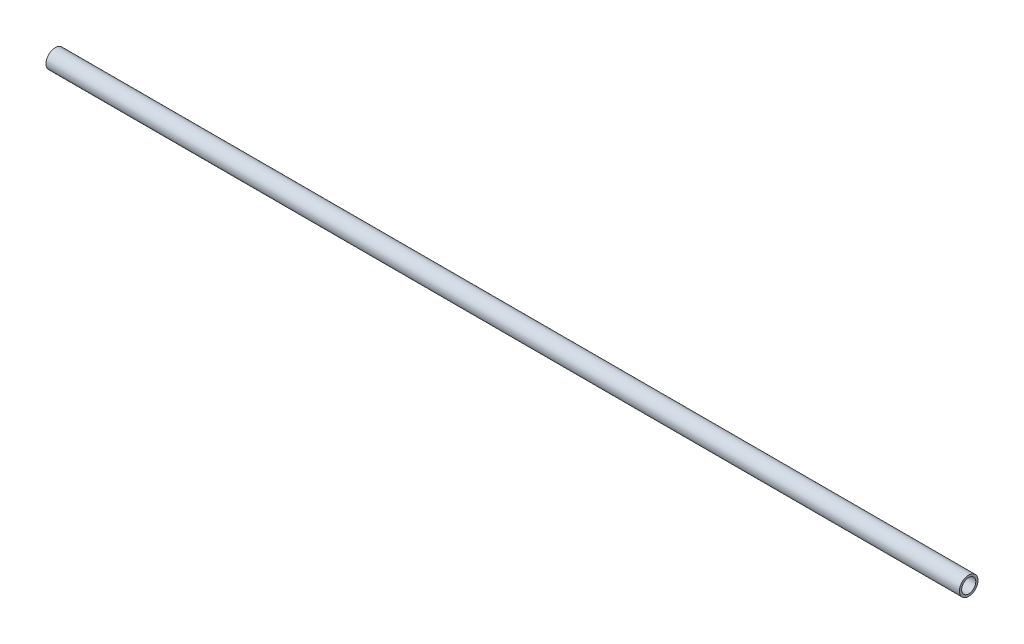
ISO-10303-21;
HEADER;
FILE_DESCRIPTION(('STEP AP214'),'2;1');
FILE_NAME('part.step','',(''),(''),'','','');
FILE_SCHEMA(('AUTOMOTIVE_DESIGN { 1 0 10303 214 1 1 1 1 }'));
ENDSEC;
DATA;
#1=APPLICATION_CONTEXT('core data for automotive mechanical design processes');
#2=APPLICATION_PROTOCOL_DEFINITION('international standard','automotive_design',2000,#1);
#3=PRODUCT_CONTEXT('',#1,'mechanical');
#4=PRODUCT('Part','Part','',(#3));
#5=PRODUCT_RELATED_PRODUCT_CATEGORY('part','',(#4));
#6=PRODUCT_DEFINITION_FORMATION('','',#4);
#7=PRODUCT_DEFINITION_CONTEXT('part definition',#1,'design');
#8=PRODUCT_DEFINITION('design','',#6,#7);
#9=PRODUCT_DEFINITION_SHAPE('','',#8);
#10=(LENGTH_UNIT() NAMED_UNIT(*) SI_UNIT(.MILLI.,.METRE.));
#11=(NAMED_UNIT(*) PLANE_ANGLE_UNIT() SI_UNIT($,.RADIAN.));
#12=(NAMED_UNIT(*) SI_UNIT($,.STERADIAN.) SOLID_ANGLE_UNIT());
#13=UNCERTAINTY_MEASURE_WITH_UNIT(LENGTH_MEASURE(1.E-05),#10,'distance_accuracy_value','');
#14=(GEOMETRIC_REPRESENTATION_CONTEXT(3) GLOBAL_UNCERTAINTY_ASSIGNED_CONTEXT((#13)) GLOBAL_UNIT_ASSIGNED_CONTEXT((#10,
#11,#12)) REPRESENTATION_CONTEXT('',''));
#15=CARTESIAN_POINT('',(0.,0.,0.));
#16=DIRECTION('',(0.,0.,1.));
#17=DIRECTION('',(1.,0.,0.));
#18=AXIS2_PLACEMENT_3D('',#15,#16,#17);
#19=CARTESIAN_POINT('',(1250.,0.,0.));
#20=DIRECTION('',(1.,0.,0.));
#21=DIRECTION('',(0.,0.,-1.));
#22=AXIS2_PLACEMENT_3D('',#19,#20,#21);
#23=PLANE('',#22);
#24=CARTESIAN_POINT('',(1250.,0.,0.));
#25=DIRECTION('',(1.,0.,0.));
#26=DIRECTION('',(0.,0.,-1.));
#27=AXIS2_PLACEMENT_3D('',#24,#25,#26);
#28=CIRCLE('',#27,12.7);
#29=CARTESIAN_POINT('',(1250.,0.,-12.7));
#30=VERTEX_POINT('',#29);
#31=EDGE_CURVE('E10',#30,#30,#28,.T.);
#32=ORIENTED_EDGE('',*,*,#31,.T.);
#33=EDGE_LOOP('',(#32));
#34=FACE_BOUND('',#33,.T.);
#35=CARTESIAN_POINT('',(1250.,0.,0.));
#36=DIRECTION('',(1.,0.,0.));
#37=DIRECTION('',(0.,0.,-1.));
#38=AXIS2_PLACEMENT_3D('',#35,#36,#37);
#39=CIRCLE('',#38,9.652);
#40=CARTESIAN_POINT('',(1250.,0.,-9.652));
#41=VERTEX_POINT('',#40);
#42=EDGE_CURVE('E45',#41,#41,#39,.T.);
#43=ORIENTED_EDGE('',*,*,#42,.F.);
#44=EDGE_LOOP('',(#43));
#45=FACE_BOUND('',#44,.T.);
#46=ADVANCED_FACE('F34',(#34,#45),#23,.T.);
#47=CARTESIAN_POINT('',(0.,0.,0.));
#48=DIRECTION('',(1.,0.,0.));
#49=DIRECTION('',(0.,0.,-1.));
#50=AXIS2_PLACEMENT_3D('',#47,#48,#49);
#51=PLANE('',#50);
#52=CARTESIAN_POINT('',(0.,0.,0.));
#53=DIRECTION('',(1.,0.,0.));
#54=DIRECTION('',(0.,0.,-1.));
#55=AXIS2_PLACEMENT_3D('',#52,#53,#54);
#56=CIRCLE('',#55,12.7);
#57=CARTESIAN_POINT('',(0.,0.,-12.7));
#58=VERTEX_POINT('',#57);
#59=EDGE_CURVE('E38',#58,#58,#56,.T.);
#60=ORIENTED_EDGE('',*,*,#59,.F.);
#61=EDGE_LOOP('',(#60));
#62=FACE_BOUND('',#61,.T.);
#63=CARTESIAN_POINT('',(0.,0.,0.));
#64=DIRECTION('',(1.,0.,0.));
#65=DIRECTION('',(0.,0.,-1.));
#66=AXIS2_PLACEMENT_3D('',#63,#64,#65);
#67=CIRCLE('',#66,9.652);
#68=CARTESIAN_POINT('',(0.,0.,-9.652));
#69=VERTEX_POINT('',#68);
#70=EDGE_CURVE('E47',#69,#69,#67,.T.);
#71=ORIENTED_EDGE('',*,*,#70,.T.);
#72=EDGE_LOOP('',(#71));
#73=FACE_BOUND('',#72,.T.);
#74=ADVANCED_FACE('F57',(#62,#73),#51,.F.);
#75=CARTESIAN_POINT('',(1250.,0.,0.));
#76=DIRECTION('',(-1.,0.,0.));
#77=DIRECTION('',(0.,0.,1.));
#78=AXIS2_PLACEMENT_3D('',#75,#76,#77);
#79=CYLINDRICAL_SURFACE('',#78,12.7);
#80=ORIENTED_EDGE('',*,*,#31,.F.);
#81=EDGE_LOOP('',(#80));
#82=FACE_BOUND('',#81,.T.);
#83=ORIENTED_EDGE('',*,*,#59,.T.);
#84=EDGE_LOOP('',(#83));
#85=FACE_BOUND('',#84,.T.);
#86=ADVANCED_FACE('F36',(#82,#85),#79,.T.);
#87=CARTESIAN_POINT('',(1250.,0.,0.));
#88=DIRECTION('',(-1.,0.,0.));
#89=DIRECTION('',(0.,0.,1.));
#90=AXIS2_PLACEMENT_3D('',#87,#88,#89);
#91=CYLINDRICAL_SURFACE('',#90,9.652);
#92=ORIENTED_EDGE('',*,*,#42,.T.);
#93=EDGE_LOOP('',(#92));
#94=FACE_BOUND('',#93,.T.);
#95=ORIENTED_EDGE('',*,*,#70,.F.);
#96=EDGE_LOOP('',(#95));
#97=FACE_BOUND('',#96,.T.);
#98=ADVANCED_FACE('F53',(#94,#97),#91,.F.);
#99=CLOSED_SHELL('',(#46,#74,#86,#98));
#100=MANIFOLD_SOLID_BREP('B2',#99);
#101=ADVANCED_BREP_SHAPE_REPRESENTATION('',(#18,#100),#14);
#102=SHAPE_DEFINITION_REPRESENTATION(#9,#101);
ENDSEC;
END-ISO-10303-21;
